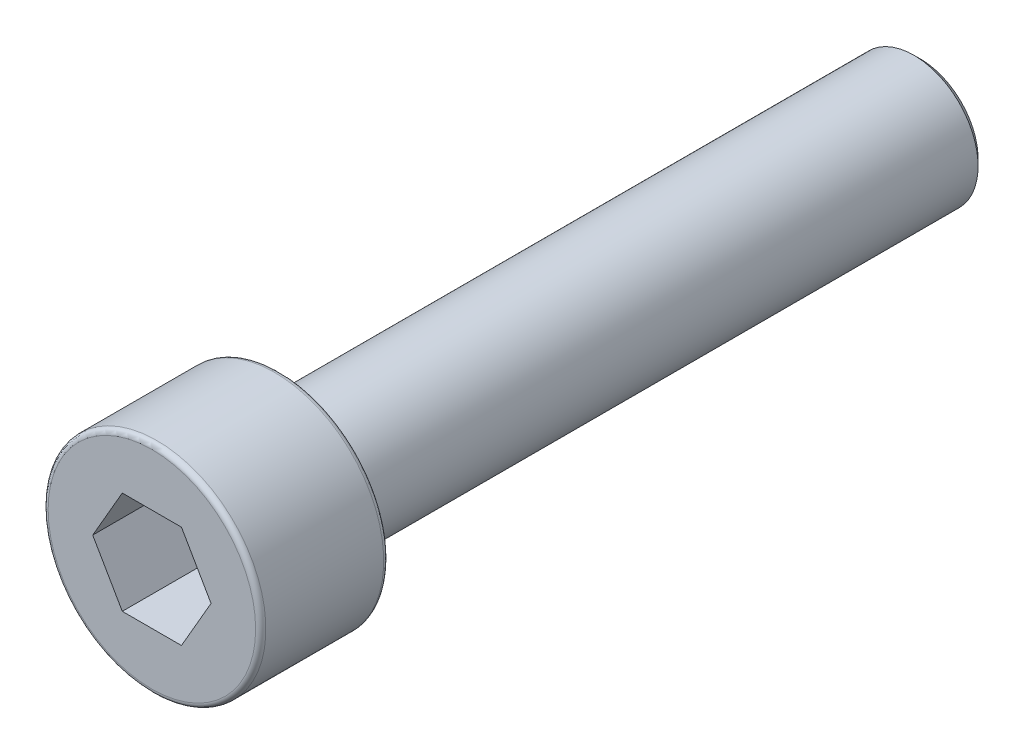
ISO-10303-21;
HEADER;
FILE_DESCRIPTION(('STEP AP214'),'2;1');
FILE_NAME('part.step','',(''),(''),'','','');
FILE_SCHEMA(('AUTOMOTIVE_DESIGN { 1 0 10303 214 1 1 1 1 }'));
ENDSEC;
DATA;
#1=APPLICATION_CONTEXT('core data for automotive mechanical design processes');
#2=APPLICATION_PROTOCOL_DEFINITION('international standard','automotive_design',2000,#1);
#3=PRODUCT_CONTEXT('',#1,'mechanical');
#4=PRODUCT('Part','Part','',(#3));
#5=PRODUCT_RELATED_PRODUCT_CATEGORY('part','',(#4));
#6=PRODUCT_DEFINITION_FORMATION('','',#4);
#7=PRODUCT_DEFINITION_CONTEXT('part definition',#1,'design');
#8=PRODUCT_DEFINITION('design','',#6,#7);
#9=PRODUCT_DEFINITION_SHAPE('','',#8);
#10=(LENGTH_UNIT() NAMED_UNIT(*) SI_UNIT(.MILLI.,.METRE.));
#11=(NAMED_UNIT(*) PLANE_ANGLE_UNIT() SI_UNIT($,.RADIAN.));
#12=(NAMED_UNIT(*) SI_UNIT($,.STERADIAN.) SOLID_ANGLE_UNIT());
#13=UNCERTAINTY_MEASURE_WITH_UNIT(LENGTH_MEASURE(1.E-05),#10,'distance_accuracy_value','');
#14=(GEOMETRIC_REPRESENTATION_CONTEXT(3) GLOBAL_UNCERTAINTY_ASSIGNED_CONTEXT((#13)) GLOBAL_UNIT_ASSIGNED_CONTEXT((#10,
#11,#12)) REPRESENTATION_CONTEXT('',''));
#15=CARTESIAN_POINT('',(0.,0.,0.));
#16=DIRECTION('',(0.,0.,1.));
#17=DIRECTION('',(1.,0.,0.));
#18=AXIS2_PLACEMENT_3D('',#15,#16,#17);
#19=CARTESIAN_POINT('',(0.,0.,25.));
#20=DIRECTION('',(0.,0.,-1.));
#21=DIRECTION('',(-1.,0.,0.));
#22=AXIS2_PLACEMENT_3D('',#19,#20,#21);
#23=PLANE('',#22);
#24=CARTESIAN_POINT('',(0.,0.,25.));
#25=DIRECTION('',(0.,0.,-1.));
#26=DIRECTION('',(-1.,0.,0.));
#27=AXIS2_PLACEMENT_3D('',#24,#25,#26);
#28=CIRCLE('',#27,4.05);
#29=CARTESIAN_POINT('',(-4.05,0.,25.));
#30=VERTEX_POINT('',#29);
#31=EDGE_CURVE('E40',#30,#30,#28,.T.);
#32=ORIENTED_EDGE('',*,*,#31,.T.);
#33=EDGE_LOOP('',(#32));
#34=FACE_BOUND('',#33,.T.);
#35=CARTESIAN_POINT('',(0.,0.,25.));
#36=DIRECTION('',(0.,0.,-1.));
#37=DIRECTION('',(-1.,0.,0.));
#38=AXIS2_PLACEMENT_3D('',#35,#36,#37);
#39=CIRCLE('',#38,2.5);
#40=CARTESIAN_POINT('',(-2.5,0.,25.));
#41=VERTEX_POINT('',#40);
#42=EDGE_CURVE('E134',#41,#41,#39,.T.);
#43=ORIENTED_EDGE('',*,*,#42,.F.);
#44=EDGE_LOOP('',(#43));
#45=FACE_BOUND('',#44,.T.);
#46=ADVANCED_FACE('F32',(#34,#45),#23,.T.);
#47=CARTESIAN_POINT('',(0.,0.,25.));
#48=DIRECTION('',(0.,0.,1.));
#49=DIRECTION('',(1.,0.,0.));
#50=AXIS2_PLACEMENT_3D('',#47,#48,#49);
#51=CYLINDRICAL_SURFACE('',#50,4.25);
#52=CARTESIAN_POINT('',(0.,0.,25.2));
#53=DIRECTION('',(0.,0.,-1.));
#54=DIRECTION('',(-1.,0.,0.));
#55=AXIS2_PLACEMENT_3D('',#52,#53,#54);
#56=CIRCLE('',#55,4.25);
#57=CARTESIAN_POINT('',(-4.25,0.,25.2));
#58=VERTEX_POINT('',#57);
#59=EDGE_CURVE('E151',#58,#58,#56,.F.);
#60=ORIENTED_EDGE('',*,*,#59,.T.);
#61=EDGE_LOOP('',(#60));
#62=FACE_BOUND('',#61,.T.);
#63=CARTESIAN_POINT('',(0.,0.,29.8));
#64=DIRECTION('',(0.,0.,-1.));
#65=DIRECTION('',(-1.,0.,0.));
#66=AXIS2_PLACEMENT_3D('',#63,#64,#65);
#67=CIRCLE('',#66,4.25);
#68=CARTESIAN_POINT('',(-4.25,0.,29.8));
#69=VERTEX_POINT('',#68);
#70=EDGE_CURVE('E148',#69,#69,#67,.T.);
#71=ORIENTED_EDGE('',*,*,#70,.T.);
#72=EDGE_LOOP('',(#71));
#73=FACE_BOUND('',#72,.T.);
#74=ADVANCED_FACE('F164',(#62,#73),#51,.T.);
#75=CARTESIAN_POINT('',(0.,0.,30.));
#76=DIRECTION('',(0.,0.,-1.));
#77=DIRECTION('',(-1.,0.,0.));
#78=AXIS2_PLACEMENT_3D('',#75,#76,#77);
#79=PLANE('',#78);
#80=CARTESIAN_POINT('',(0.,0.,30.));
#81=DIRECTION('',(0.,0.,-1.));
#82=DIRECTION('',(-1.,0.,0.));
#83=AXIS2_PLACEMENT_3D('',#80,#81,#82);
#84=CIRCLE('',#83,4.05);
#85=CARTESIAN_POINT('',(-4.05,0.,30.));
#86=VERTEX_POINT('',#85);
#87=EDGE_CURVE('E11',#86,#86,#84,.F.);
#88=ORIENTED_EDGE('',*,*,#87,.T.);
#89=EDGE_LOOP('',(#88));
#90=FACE_BOUND('',#89,.T.);
#91=DIRECTION('',(0.499999999999999,-0.866025403784439,0.));
#92=VECTOR('',#91,1.);
#93=CARTESIAN_POINT('',(-2.3094010767585,0.,30.));
#94=LINE('',#93,#92);
#95=CARTESIAN_POINT('',(-2.3094010767585,0.,30.));
#96=VERTEX_POINT('',#95);
#97=CARTESIAN_POINT('',(-1.15470053837925,-2.,30.));
#98=VERTEX_POINT('',#97);
#99=EDGE_CURVE('E121',#96,#98,#94,.T.);
#100=ORIENTED_EDGE('',*,*,#99,.F.);
#101=DIRECTION('',(-0.499999999999999,-0.866025403784439,0.));
#102=VECTOR('',#101,1.);
#103=CARTESIAN_POINT('',(-1.15470053837925,2.,30.));
#104=LINE('',#103,#102);
#105=CARTESIAN_POINT('',(-1.15470053837925,2.,30.));
#106=VERTEX_POINT('',#105);
#107=EDGE_CURVE('E47',#106,#96,#104,.T.);
#108=ORIENTED_EDGE('',*,*,#107,.F.);
#109=DIRECTION('',(-1.,0.,0.));
#110=VECTOR('',#109,1.);
#111=CARTESIAN_POINT('',(1.15470053837925,2.,30.));
#112=LINE('',#111,#110);
#113=CARTESIAN_POINT('',(1.15470053837925,2.,30.));
#114=VERTEX_POINT('',#113);
#115=EDGE_CURVE('E130',#114,#106,#112,.T.);
#116=ORIENTED_EDGE('',*,*,#115,.F.);
#117=DIRECTION('',(-0.499999999999999,0.866025403784439,0.));
#118=VECTOR('',#117,1.);
#119=CARTESIAN_POINT('',(2.3094010767585,0.,30.));
#120=LINE('',#119,#118);
#121=CARTESIAN_POINT('',(2.3094010767585,0.,30.));
#122=VERTEX_POINT('',#121);
#123=EDGE_CURVE('E128',#122,#114,#120,.T.);
#124=ORIENTED_EDGE('',*,*,#123,.F.);
#125=DIRECTION('',(0.499999999999999,0.866025403784439,0.));
#126=VECTOR('',#125,1.);
#127=CARTESIAN_POINT('',(1.15470053837925,-2.,30.));
#128=LINE('',#127,#126);
#129=CARTESIAN_POINT('',(1.15470053837925,-2.,30.));
#130=VERTEX_POINT('',#129);
#131=EDGE_CURVE('E95',#130,#122,#128,.T.);
#132=ORIENTED_EDGE('',*,*,#131,.F.);
#133=DIRECTION('',(1.,0.,0.));
#134=VECTOR('',#133,1.);
#135=CARTESIAN_POINT('',(-1.15470053837925,-2.,30.));
#136=LINE('',#135,#134);
#137=EDGE_CURVE('E124',#98,#130,#136,.T.);
#138=ORIENTED_EDGE('',*,*,#137,.F.);
#139=EDGE_LOOP('',(#100,#108,#116,#124,#132,#138));
#140=FACE_BOUND('',#139,.T.);
#141=ADVANCED_FACE('F167',(#90,#140),#79,.F.);
#142=CARTESIAN_POINT('',(0.,0.,0.));
#143=DIRECTION('',(0.,0.,1.));
#144=DIRECTION('',(1.,0.,0.));
#145=AXIS2_PLACEMENT_3D('',#142,#143,#144);
#146=CYLINDRICAL_SURFACE('',#145,2.5);
#147=CARTESIAN_POINT('',(0.,0.,0.25000000005503));
#148=DIRECTION('',(0.,0.,-1.));
#149=DIRECTION('',(-1.,0.,0.));
#150=AXIS2_PLACEMENT_3D('',#147,#148,#149);
#151=CIRCLE('',#150,2.5);
#152=CARTESIAN_POINT('',(-2.5,0.,0.25000000005503));
#153=VERTEX_POINT('',#152);
#154=EDGE_CURVE('E145',#153,#153,#151,.F.);
#155=ORIENTED_EDGE('',*,*,#154,.T.);
#156=EDGE_LOOP('',(#155));
#157=FACE_BOUND('',#156,.T.);
#158=ORIENTED_EDGE('',*,*,#42,.T.);
#159=EDGE_LOOP('',(#158));
#160=FACE_BOUND('',#159,.T.);
#161=ADVANCED_FACE('F177',(#157,#160),#146,.T.);
#162=CARTESIAN_POINT('',(0.,0.,0.));
#163=DIRECTION('',(0.,0.,-1.));
#164=DIRECTION('',(-1.,0.,0.));
#165=AXIS2_PLACEMENT_3D('',#162,#163,#164);
#166=PLANE('',#165);
#167=CARTESIAN_POINT('',(0.,0.,0.));
#168=DIRECTION('',(0.,0.,-1.));
#169=DIRECTION('',(-1.,0.,0.));
#170=AXIS2_PLACEMENT_3D('',#167,#168,#169);
#171=CIRCLE('',#170,2.24999999994497);
#172=CARTESIAN_POINT('',(-2.24999999994497,0.,0.));
#173=VERTEX_POINT('',#172);
#174=EDGE_CURVE('E142',#173,#173,#171,.T.);
#175=ORIENTED_EDGE('',*,*,#174,.T.);
#176=EDGE_LOOP('',(#175));
#177=FACE_BOUND('',#176,.T.);
#178=ADVANCED_FACE('F188',(#177),#166,.T.);
#179=CARTESIAN_POINT('',(-1.15470053837925,2.,26.));
#180=DIRECTION('',(-0.866025403784439,0.499999999999999,0.));
#181=DIRECTION('',(-0.499999999999999,-0.866025403784439,0.));
#182=AXIS2_PLACEMENT_3D('',#179,#180,#181);
#183=PLANE('',#182);
#184=ORIENTED_EDGE('',*,*,#107,.T.);
#185=DIRECTION('',(0.,0.,1.));
#186=VECTOR('',#185,1.);
#187=CARTESIAN_POINT('',(-2.3094010767585,0.,26.));
#188=LINE('',#187,#186);
#189=CARTESIAN_POINT('',(-2.3094010767585,0.,26.));
#190=VERTEX_POINT('',#189);
#191=EDGE_CURVE('E77',#190,#96,#188,.T.);
#192=ORIENTED_EDGE('',*,*,#191,.F.);
#193=DIRECTION('',(-0.499999999999999,-0.866025403784439,0.));
#194=VECTOR('',#193,1.);
#195=CARTESIAN_POINT('',(-1.15470053837925,2.,26.));
#196=LINE('',#195,#194);
#197=CARTESIAN_POINT('',(-1.15470053837925,2.,26.));
#198=VERTEX_POINT('',#197);
#199=EDGE_CURVE('E132',#198,#190,#196,.T.);
#200=ORIENTED_EDGE('',*,*,#199,.F.);
#201=DIRECTION('',(0.,0.,1.));
#202=VECTOR('',#201,1.);
#203=CARTESIAN_POINT('',(-1.15470053837925,2.,26.));
#204=LINE('',#203,#202);
#205=EDGE_CURVE('E55',#198,#106,#204,.T.);
#206=ORIENTED_EDGE('',*,*,#205,.T.);
#207=EDGE_LOOP('',(#184,#192,#200,#206));
#208=FACE_BOUND('',#207,.T.);
#209=ADVANCED_FACE('F185',(#208),#183,.F.);
#210=CARTESIAN_POINT('',(1.15470053837925,2.,26.));
#211=DIRECTION('',(0.,1.,0.));
#212=DIRECTION('',(-1.,0.,0.));
#213=AXIS2_PLACEMENT_3D('',#210,#211,#212);
#214=PLANE('',#213);
#215=ORIENTED_EDGE('',*,*,#115,.T.);
#216=ORIENTED_EDGE('',*,*,#205,.F.);
#217=DIRECTION('',(-1.,0.,0.));
#218=VECTOR('',#217,1.);
#219=CARTESIAN_POINT('',(1.15470053837925,2.,26.));
#220=LINE('',#219,#218);
#221=CARTESIAN_POINT('',(1.15470053837925,2.,26.));
#222=VERTEX_POINT('',#221);
#223=EDGE_CURVE('E107',#222,#198,#220,.T.);
#224=ORIENTED_EDGE('',*,*,#223,.F.);
#225=DIRECTION('',(0.,0.,1.));
#226=VECTOR('',#225,1.);
#227=CARTESIAN_POINT('',(1.15470053837925,2.,26.));
#228=LINE('',#227,#226);
#229=EDGE_CURVE('E99',#222,#114,#228,.T.);
#230=ORIENTED_EDGE('',*,*,#229,.T.);
#231=EDGE_LOOP('',(#215,#216,#224,#230));
#232=FACE_BOUND('',#231,.T.);
#233=ADVANCED_FACE('F187',(#232),#214,.F.);
#234=CARTESIAN_POINT('',(2.3094010767585,0.,26.));
#235=DIRECTION('',(0.866025403784439,0.499999999999999,0.));
#236=DIRECTION('',(-0.499999999999999,0.866025403784439,0.));
#237=AXIS2_PLACEMENT_3D('',#234,#235,#236);
#238=PLANE('',#237);
#239=ORIENTED_EDGE('',*,*,#123,.T.);
#240=ORIENTED_EDGE('',*,*,#229,.F.);
#241=DIRECTION('',(-0.499999999999999,0.866025403784439,0.));
#242=VECTOR('',#241,1.);
#243=CARTESIAN_POINT('',(2.3094010767585,0.,26.));
#244=LINE('',#243,#242);
#245=CARTESIAN_POINT('',(2.3094010767585,0.,26.));
#246=VERTEX_POINT('',#245);
#247=EDGE_CURVE('E103',#246,#222,#244,.T.);
#248=ORIENTED_EDGE('',*,*,#247,.F.);
#249=DIRECTION('',(0.,0.,1.));
#250=VECTOR('',#249,1.);
#251=CARTESIAN_POINT('',(2.3094010767585,0.,26.));
#252=LINE('',#251,#250);
#253=EDGE_CURVE('E88',#246,#122,#252,.T.);
#254=ORIENTED_EDGE('',*,*,#253,.T.);
#255=EDGE_LOOP('',(#239,#240,#248,#254));
#256=FACE_BOUND('',#255,.T.);
#257=ADVANCED_FACE('F104',(#256),#238,.F.);
#258=CARTESIAN_POINT('',(1.15470053837925,-2.,26.));
#259=DIRECTION('',(0.866025403784439,-0.499999999999999,0.));
#260=DIRECTION('',(0.5,0.866025403784439,0.));
#261=AXIS2_PLACEMENT_3D('',#258,#259,#260);
#262=PLANE('',#261);
#263=ORIENTED_EDGE('',*,*,#131,.T.);
#264=ORIENTED_EDGE('',*,*,#253,.F.);
#265=DIRECTION('',(0.499999999999999,0.866025403784439,0.));
#266=VECTOR('',#265,1.);
#267=CARTESIAN_POINT('',(1.15470053837925,-2.,26.));
#268=LINE('',#267,#266);
#269=CARTESIAN_POINT('',(1.15470053837925,-2.,26.));
#270=VERTEX_POINT('',#269);
#271=EDGE_CURVE('E92',#270,#246,#268,.T.);
#272=ORIENTED_EDGE('',*,*,#271,.F.);
#273=DIRECTION('',(0.,0.,1.));
#274=VECTOR('',#273,1.);
#275=CARTESIAN_POINT('',(1.15470053837925,-2.,26.));
#276=LINE('',#275,#274);
#277=EDGE_CURVE('E100',#270,#130,#276,.T.);
#278=ORIENTED_EDGE('',*,*,#277,.T.);
#279=EDGE_LOOP('',(#263,#264,#272,#278));
#280=FACE_BOUND('',#279,.T.);
#281=ADVANCED_FACE('F90',(#280),#262,.F.);
#282=CARTESIAN_POINT('',(-1.15470053837925,-2.,26.));
#283=DIRECTION('',(0.,-1.,0.));
#284=DIRECTION('',(1.,0.,0.));
#285=AXIS2_PLACEMENT_3D('',#282,#283,#284);
#286=PLANE('',#285);
#287=ORIENTED_EDGE('',*,*,#137,.T.);
#288=ORIENTED_EDGE('',*,*,#277,.F.);
#289=DIRECTION('',(1.,0.,0.));
#290=VECTOR('',#289,1.);
#291=CARTESIAN_POINT('',(-1.15470053837925,-2.,26.));
#292=LINE('',#291,#290);
#293=CARTESIAN_POINT('',(-1.15470053837925,-2.,26.));
#294=VERTEX_POINT('',#293);
#295=EDGE_CURVE('E113',#294,#270,#292,.T.);
#296=ORIENTED_EDGE('',*,*,#295,.F.);
#297=DIRECTION('',(0.,0.,1.));
#298=VECTOR('',#297,1.);
#299=CARTESIAN_POINT('',(-1.15470053837925,-2.,26.));
#300=LINE('',#299,#298);
#301=EDGE_CURVE('E137',#294,#98,#300,.T.);
#302=ORIENTED_EDGE('',*,*,#301,.T.);
#303=EDGE_LOOP('',(#287,#288,#296,#302));
#304=FACE_BOUND('',#303,.T.);
#305=ADVANCED_FACE('F273',(#304),#286,.F.);
#306=CARTESIAN_POINT('',(-2.3094010767585,0.,26.));
#307=DIRECTION('',(-0.866025403784439,-0.499999999999999,0.));
#308=DIRECTION('',(0.499999999999999,-0.866025403784439,0.));
#309=AXIS2_PLACEMENT_3D('',#306,#307,#308);
#310=PLANE('',#309);
#311=ORIENTED_EDGE('',*,*,#99,.T.);
#312=ORIENTED_EDGE('',*,*,#301,.F.);
#313=DIRECTION('',(0.499999999999999,-0.866025403784439,0.));
#314=VECTOR('',#313,1.);
#315=CARTESIAN_POINT('',(-2.3094010767585,0.,26.));
#316=LINE('',#315,#314);
#317=EDGE_CURVE('E115',#190,#294,#316,.T.);
#318=ORIENTED_EDGE('',*,*,#317,.F.);
#319=ORIENTED_EDGE('',*,*,#191,.T.);
#320=EDGE_LOOP('',(#311,#312,#318,#319));
#321=FACE_BOUND('',#320,.T.);
#322=ADVANCED_FACE('F183',(#321),#310,.F.);
#323=CARTESIAN_POINT('',(0.,0.,26.));
#324=DIRECTION('',(0.,0.,1.));
#325=DIRECTION('',(1.,0.,0.));
#326=AXIS2_PLACEMENT_3D('',#323,#324,#325);
#327=PLANE('',#326);
#328=ORIENTED_EDGE('',*,*,#199,.T.);
#329=ORIENTED_EDGE('',*,*,#317,.T.);
#330=ORIENTED_EDGE('',*,*,#295,.T.);
#331=ORIENTED_EDGE('',*,*,#271,.T.);
#332=ORIENTED_EDGE('',*,*,#247,.T.);
#333=ORIENTED_EDGE('',*,*,#223,.T.);
#334=EDGE_LOOP('',(#328,#329,#330,#331,#332,#333));
#335=FACE_BOUND('',#334,.T.);
#336=ADVANCED_FACE('F110',(#335),#327,.T.);
#337=CARTESIAN_POINT('',(0.,0.,0.));
#338=DIRECTION('',(0.,0.,1.));
#339=DIRECTION('',(1.,0.,0.));
#340=AXIS2_PLACEMENT_3D('',#337,#338,#339);
#341=CONICAL_SURFACE('',#340,2.24999999994497,0.785398163397449);
#342=ORIENTED_EDGE('',*,*,#154,.F.);
#343=EDGE_LOOP('',(#342));
#344=FACE_BOUND('',#343,.T.);
#345=ORIENTED_EDGE('',*,*,#174,.F.);
#346=EDGE_LOOP('',(#345));
#347=FACE_BOUND('',#346,.T.);
#348=ADVANCED_FACE('F161',(#344,#347),#341,.T.);
#349=CARTESIAN_POINT('',(0.,0.,25.2));
#350=DIRECTION('',(0.,0.,-1.));
#351=DIRECTION('',(-1.,0.,0.));
#352=AXIS2_PLACEMENT_3D('',#349,#350,#351);
#353=TOROIDAL_SURFACE('',#352,4.05,0.200000000000001);
#354=ORIENTED_EDGE('',*,*,#31,.F.);
#355=EDGE_LOOP('',(#354));
#356=FACE_BOUND('',#355,.T.);
#357=ORIENTED_EDGE('',*,*,#59,.F.);
#358=EDGE_LOOP('',(#357));
#359=FACE_BOUND('',#358,.T.);
#360=ADVANCED_FACE('F158',(#356,#359),#353,.T.);
#361=CARTESIAN_POINT('',(0.,0.,29.8));
#362=DIRECTION('',(0.,0.,-1.));
#363=DIRECTION('',(-1.,0.,0.));
#364=AXIS2_PLACEMENT_3D('',#361,#362,#363);
#365=TOROIDAL_SURFACE('',#364,4.05,0.200000000000001);
#366=ORIENTED_EDGE('',*,*,#70,.F.);
#367=EDGE_LOOP('',(#366));
#368=FACE_BOUND('',#367,.T.);
#369=ORIENTED_EDGE('',*,*,#87,.F.);
#370=EDGE_LOOP('',(#369));
#371=FACE_BOUND('',#370,.T.);
#372=ADVANCED_FACE('F34',(#368,#371),#365,.T.);
#373=CLOSED_SHELL('',(#46,#74,#141,#161,#178,#209,#233,#257,#281,#305,#322,#336,#348,#360,#372));
#374=MANIFOLD_SOLID_BREP('B2',#373);
#375=ADVANCED_BREP_SHAPE_REPRESENTATION('',(#18,#374),#14);
#376=SHAPE_DEFINITION_REPRESENTATION(#9,#375);
ENDSEC;
END-ISO-10303-21;
